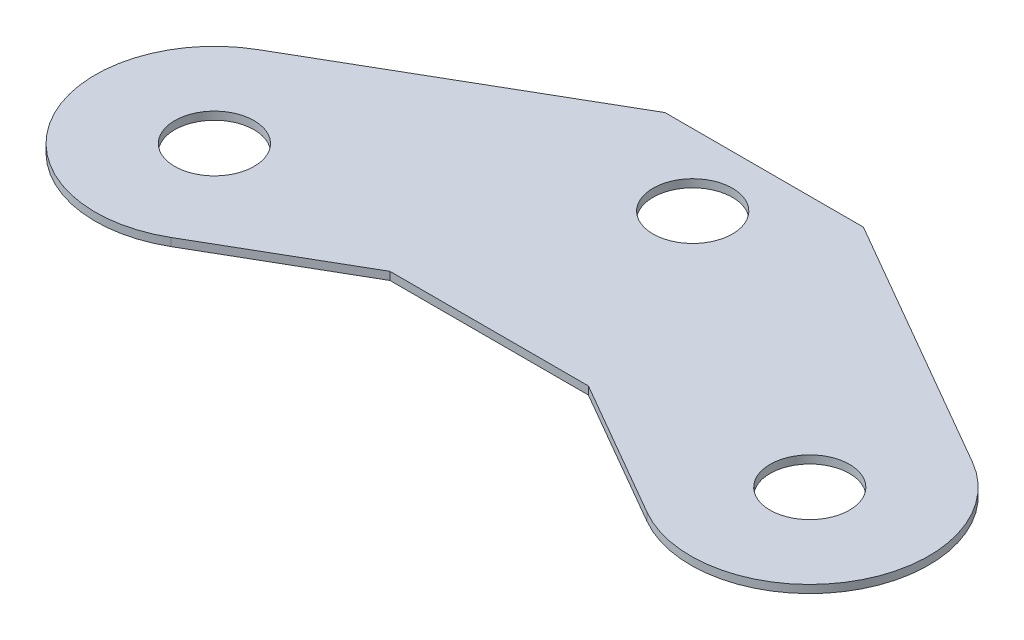
ISO-10303-21;
HEADER;
FILE_DESCRIPTION(('STEP AP214'),'2;1');
FILE_NAME('part.step','',(''),(''),'','','');
FILE_SCHEMA(('AUTOMOTIVE_DESIGN { 1 0 10303 214 1 1 1 1 }'));
ENDSEC;
DATA;
#1=APPLICATION_CONTEXT('core data for automotive mechanical design processes');
#2=APPLICATION_PROTOCOL_DEFINITION('international standard','automotive_design',2000,#1);
#3=PRODUCT_CONTEXT('',#1,'mechanical');
#4=PRODUCT('Part','Part','',(#3));
#5=PRODUCT_RELATED_PRODUCT_CATEGORY('part','',(#4));
#6=PRODUCT_DEFINITION_FORMATION('','',#4);
#7=PRODUCT_DEFINITION_CONTEXT('part definition',#1,'design');
#8=PRODUCT_DEFINITION('design','',#6,#7);
#9=PRODUCT_DEFINITION_SHAPE('','',#8);
#10=(LENGTH_UNIT() NAMED_UNIT(*) SI_UNIT(.MILLI.,.METRE.));
#11=(NAMED_UNIT(*) PLANE_ANGLE_UNIT() SI_UNIT($,.RADIAN.));
#12=(NAMED_UNIT(*) SI_UNIT($,.STERADIAN.) SOLID_ANGLE_UNIT());
#13=UNCERTAINTY_MEASURE_WITH_UNIT(LENGTH_MEASURE(1.E-05),#10,'distance_accuracy_value','');
#14=(GEOMETRIC_REPRESENTATION_CONTEXT(3) GLOBAL_UNCERTAINTY_ASSIGNED_CONTEXT((#13)) GLOBAL_UNIT_ASSIGNED_CONTEXT((#10,
#11,#12)) REPRESENTATION_CONTEXT('',''));
#15=CARTESIAN_POINT('',(0.,0.,0.));
#16=DIRECTION('',(0.,0.,1.));
#17=DIRECTION('',(1.,0.,0.));
#18=AXIS2_PLACEMENT_3D('',#15,#16,#17);
#19=CARTESIAN_POINT('',(-12.5,1.,-34.6410161513776));
#20=DIRECTION('',(0.499999999999998,0.,0.86602540378444));
#21=DIRECTION('',(-0.86602540378444,0.,0.499999999999998));
#22=AXIS2_PLACEMENT_3D('',#19,#20,#21);
#23=PLANE('',#22);
#24=DIRECTION('',(0.,1.,0.));
#25=VECTOR('',#24,1.);
#26=CARTESIAN_POINT('',(-12.5,1.,-34.6410161513776));
#27=LINE('',#26,#25);
#28=CARTESIAN_POINT('',(-12.5,0.,-34.6410161513776));
#29=VERTEX_POINT('',#28);
#30=CARTESIAN_POINT('',(-12.5,1.,-34.6410161513776));
#31=VERTEX_POINT('',#30);
#32=EDGE_CURVE('E11',#29,#31,#27,.T.);
#33=ORIENTED_EDGE('',*,*,#32,.F.);
#34=DIRECTION('',(-0.86602540378444,0.,0.499999999999998));
#35=VECTOR('',#34,1.);
#36=CARTESIAN_POINT('',(-12.5,0.,-34.6410161513776));
#37=LINE('',#36,#35);
#38=CARTESIAN_POINT('',(-45.,0.,-15.8771324027149));
#39=VERTEX_POINT('',#38);
#40=EDGE_CURVE('E106',#29,#39,#37,.T.);
#41=ORIENTED_EDGE('',*,*,#40,.T.);
#42=DIRECTION('',(0.,1.,0.));
#43=VECTOR('',#42,1.);
#44=CARTESIAN_POINT('',(-45.,1.,-15.8771324027149));
#45=LINE('',#44,#43);
#46=CARTESIAN_POINT('',(-45.,1.,-15.8771324027149));
#47=VERTEX_POINT('',#46);
#48=EDGE_CURVE('E47',#39,#47,#45,.T.);
#49=ORIENTED_EDGE('',*,*,#48,.T.);
#50=DIRECTION('',(-0.86602540378444,0.,0.499999999999998));
#51=VECTOR('',#50,1.);
#52=CARTESIAN_POINT('',(-12.5,1.,-34.6410161513776));
#53=LINE('',#52,#51);
#54=EDGE_CURVE('E154',#31,#47,#53,.T.);
#55=ORIENTED_EDGE('',*,*,#54,.F.);
#56=EDGE_LOOP('',(#33,#41,#49,#55));
#57=FACE_BOUND('',#56,.T.);
#58=ADVANCED_FACE('F37',(#57),#23,.F.);
#59=CARTESIAN_POINT('',(-37.5,1.,-2.8867513459483));
#60=DIRECTION('',(0.,-1.,0.));
#61=DIRECTION('',(0.,0.,-1.));
#62=AXIS2_PLACEMENT_3D('',#59,#60,#61);
#63=CYLINDRICAL_SURFACE('',#62,15.);
#64=ORIENTED_EDGE('',*,*,#48,.F.);
#65=CARTESIAN_POINT('',(-37.5,0.,-2.8867513459483));
#66=DIRECTION('',(0.,1.,0.));
#67=DIRECTION('',(0.,0.,1.));
#68=AXIS2_PLACEMENT_3D('',#65,#66,#67);
#69=CIRCLE('',#68,15.);
#70=CARTESIAN_POINT('',(-30.,0.,10.1036297108183));
#71=VERTEX_POINT('',#70);
#72=EDGE_CURVE('E125',#39,#71,#69,.T.);
#73=ORIENTED_EDGE('',*,*,#72,.T.);
#74=DIRECTION('',(0.,1.,0.));
#75=VECTOR('',#74,1.);
#76=CARTESIAN_POINT('',(-30.,1.,10.1036297108183));
#77=LINE('',#76,#75);
#78=CARTESIAN_POINT('',(-30.,1.,10.1036297108183));
#79=VERTEX_POINT('',#78);
#80=EDGE_CURVE('E147',#71,#79,#77,.T.);
#81=ORIENTED_EDGE('',*,*,#80,.T.);
#82=CARTESIAN_POINT('',(-37.5,1.,-2.8867513459483));
#83=DIRECTION('',(0.,1.,0.));
#84=DIRECTION('',(0.,0.,1.));
#85=AXIS2_PLACEMENT_3D('',#82,#83,#84);
#86=CIRCLE('',#85,15.);
#87=EDGE_CURVE('E164',#47,#79,#86,.T.);
#88=ORIENTED_EDGE('',*,*,#87,.F.);
#89=EDGE_LOOP('',(#64,#73,#81,#88));
#90=FACE_BOUND('',#89,.T.);
#91=ADVANCED_FACE('F167',(#90),#63,.T.);
#92=CARTESIAN_POINT('',(-30.,1.,10.1036297108183));
#93=DIRECTION('',(-0.499999999999994,0.,-0.866025403784442));
#94=DIRECTION('',(0.866025403784442,0.,-0.499999999999994));
#95=AXIS2_PLACEMENT_3D('',#92,#93,#94);
#96=PLANE('',#95);
#97=ORIENTED_EDGE('',*,*,#80,.F.);
#98=DIRECTION('',(0.866025403784442,0.,-0.499999999999994));
#99=VECTOR('',#98,1.);
#100=CARTESIAN_POINT('',(-30.,0.,10.1036297108183));
#101=LINE('',#100,#99);
#102=CARTESIAN_POINT('',(-12.5,0.,0.));
#103=VERTEX_POINT('',#102);
#104=EDGE_CURVE('E122',#71,#103,#101,.T.);
#105=ORIENTED_EDGE('',*,*,#104,.T.);
#106=DIRECTION('',(0.,1.,0.));
#107=VECTOR('',#106,1.);
#108=CARTESIAN_POINT('',(-12.5,1.,0.));
#109=LINE('',#108,#107);
#110=CARTESIAN_POINT('',(-12.5,1.,0.));
#111=VERTEX_POINT('',#110);
#112=EDGE_CURVE('E144',#103,#111,#109,.T.);
#113=ORIENTED_EDGE('',*,*,#112,.T.);
#114=DIRECTION('',(0.866025403784442,0.,-0.499999999999994));
#115=VECTOR('',#114,1.);
#116=CARTESIAN_POINT('',(-30.,1.,10.1036297108183));
#117=LINE('',#116,#115);
#118=EDGE_CURVE('E168',#79,#111,#117,.T.);
#119=ORIENTED_EDGE('',*,*,#118,.F.);
#120=EDGE_LOOP('',(#97,#105,#113,#119));
#121=FACE_BOUND('',#120,.T.);
#122=ADVANCED_FACE('F206',(#121),#96,.F.);
#123=CARTESIAN_POINT('',(12.5,1.,0.));
#124=DIRECTION('',(0.,0.,-1.));
#125=DIRECTION('',(1.,0.,0.));
#126=AXIS2_PLACEMENT_3D('',#123,#124,#125);
#127=PLANE('',#126);
#128=ORIENTED_EDGE('',*,*,#112,.F.);
#129=DIRECTION('',(1.,0.,0.));
#130=VECTOR('',#129,1.);
#131=CARTESIAN_POINT('',(37.5,0.,0.));
#132=LINE('',#131,#130);
#133=CARTESIAN_POINT('',(12.5,0.,0.));
#134=VERTEX_POINT('',#133);
#135=EDGE_CURVE('E119',#103,#134,#132,.T.);
#136=ORIENTED_EDGE('',*,*,#135,.T.);
#137=DIRECTION('',(0.,1.,0.));
#138=VECTOR('',#137,1.);
#139=CARTESIAN_POINT('',(12.5,1.,0.));
#140=LINE('',#139,#138);
#141=CARTESIAN_POINT('',(12.5,1.,0.));
#142=VERTEX_POINT('',#141);
#143=EDGE_CURVE('E141',#134,#142,#140,.T.);
#144=ORIENTED_EDGE('',*,*,#143,.T.);
#145=DIRECTION('',(1.,0.,0.));
#146=VECTOR('',#145,1.);
#147=CARTESIAN_POINT('',(12.5,1.,0.));
#148=LINE('',#147,#146);
#149=EDGE_CURVE('E170',#111,#142,#148,.T.);
#150=ORIENTED_EDGE('',*,*,#149,.F.);
#151=EDGE_LOOP('',(#128,#136,#144,#150));
#152=FACE_BOUND('',#151,.T.);
#153=ADVANCED_FACE('F266',(#152),#127,.F.);
#154=CARTESIAN_POINT('',(30.,1.,10.1036297108183));
#155=DIRECTION('',(0.499999999999994,0.,-0.866025403784442));
#156=DIRECTION('',(0.866025403784442,0.,0.499999999999994));
#157=AXIS2_PLACEMENT_3D('',#154,#155,#156);
#158=PLANE('',#157);
#159=ORIENTED_EDGE('',*,*,#143,.F.);
#160=DIRECTION('',(0.866025403784442,0.,0.499999999999994));
#161=VECTOR('',#160,1.);
#162=CARTESIAN_POINT('',(30.,0.,10.1036297108183));
#163=LINE('',#162,#161);
#164=CARTESIAN_POINT('',(30.,0.,10.1036297108183));
#165=VERTEX_POINT('',#164);
#166=EDGE_CURVE('E116',#134,#165,#163,.T.);
#167=ORIENTED_EDGE('',*,*,#166,.T.);
#168=DIRECTION('',(0.,1.,0.));
#169=VECTOR('',#168,1.);
#170=CARTESIAN_POINT('',(30.,1.,10.1036297108183));
#171=LINE('',#170,#169);
#172=CARTESIAN_POINT('',(30.,1.,10.1036297108183));
#173=VERTEX_POINT('',#172);
#174=EDGE_CURVE('E139',#165,#173,#171,.T.);
#175=ORIENTED_EDGE('',*,*,#174,.T.);
#176=DIRECTION('',(0.866025403784442,0.,0.499999999999994));
#177=VECTOR('',#176,1.);
#178=CARTESIAN_POINT('',(30.,1.,10.1036297108183));
#179=LINE('',#178,#177);
#180=EDGE_CURVE('E176',#142,#173,#179,.T.);
#181=ORIENTED_EDGE('',*,*,#180,.F.);
#182=EDGE_LOOP('',(#159,#167,#175,#181));
#183=FACE_BOUND('',#182,.T.);
#184=ADVANCED_FACE('F276',(#183),#158,.F.);
#185=CARTESIAN_POINT('',(37.5,1.,-2.8867513459483));
#186=DIRECTION('',(0.,-1.,0.));
#187=DIRECTION('',(0.,0.,-1.));
#188=AXIS2_PLACEMENT_3D('',#185,#186,#187);
#189=CYLINDRICAL_SURFACE('',#188,15.);
#190=ORIENTED_EDGE('',*,*,#174,.F.);
#191=CARTESIAN_POINT('',(37.5,0.,-2.8867513459483));
#192=DIRECTION('',(0.,1.,0.));
#193=DIRECTION('',(0.,0.,1.));
#194=AXIS2_PLACEMENT_3D('',#191,#192,#193);
#195=CIRCLE('',#194,15.);
#196=CARTESIAN_POINT('',(45.,0.,-15.8771324027149));
#197=VERTEX_POINT('',#196);
#198=EDGE_CURVE('E113',#165,#197,#195,.T.);
#199=ORIENTED_EDGE('',*,*,#198,.T.);
#200=DIRECTION('',(0.,1.,0.));
#201=VECTOR('',#200,1.);
#202=CARTESIAN_POINT('',(45.,1.,-15.8771324027149));
#203=LINE('',#202,#201);
#204=CARTESIAN_POINT('',(45.,1.,-15.8771324027149));
#205=VERTEX_POINT('',#204);
#206=EDGE_CURVE('E55',#197,#205,#203,.T.);
#207=ORIENTED_EDGE('',*,*,#206,.T.);
#208=CARTESIAN_POINT('',(37.5,1.,-2.8867513459483));
#209=DIRECTION('',(0.,1.,0.));
#210=DIRECTION('',(0.,0.,-1.));
#211=AXIS2_PLACEMENT_3D('',#208,#209,#210);
#212=CIRCLE('',#211,15.);
#213=EDGE_CURVE('E179',#173,#205,#212,.T.);
#214=ORIENTED_EDGE('',*,*,#213,.F.);
#215=EDGE_LOOP('',(#190,#199,#207,#214));
#216=FACE_BOUND('',#215,.T.);
#217=ADVANCED_FACE('F287',(#216),#189,.T.);
#218=CARTESIAN_POINT('',(12.5,1.,-34.6410161513776));
#219=DIRECTION('',(-0.499999999999998,0.,0.86602540378444));
#220=DIRECTION('',(-0.86602540378444,0.,-0.499999999999998));
#221=AXIS2_PLACEMENT_3D('',#218,#219,#220);
#222=PLANE('',#221);
#223=ORIENTED_EDGE('',*,*,#206,.F.);
#224=DIRECTION('',(-0.86602540378444,0.,-0.499999999999998));
#225=VECTOR('',#224,1.);
#226=CARTESIAN_POINT('',(12.5,0.,-34.6410161513776));
#227=LINE('',#226,#225);
#228=CARTESIAN_POINT('',(12.5,0.,-34.6410161513776));
#229=VERTEX_POINT('',#228);
#230=EDGE_CURVE('E104',#197,#229,#227,.T.);
#231=ORIENTED_EDGE('',*,*,#230,.T.);
#232=DIRECTION('',(0.,1.,0.));
#233=VECTOR('',#232,1.);
#234=CARTESIAN_POINT('',(12.5,1.,-34.6410161513776));
#235=LINE('',#234,#233);
#236=CARTESIAN_POINT('',(12.5,1.,-34.6410161513776));
#237=VERTEX_POINT('',#236);
#238=EDGE_CURVE('E41',#229,#237,#235,.T.);
#239=ORIENTED_EDGE('',*,*,#238,.T.);
#240=DIRECTION('',(-0.86602540378444,0.,-0.499999999999998));
#241=VECTOR('',#240,1.);
#242=CARTESIAN_POINT('',(12.5,1.,-34.6410161513776));
#243=LINE('',#242,#241);
#244=EDGE_CURVE('E137',#205,#237,#243,.T.);
#245=ORIENTED_EDGE('',*,*,#244,.F.);
#246=EDGE_LOOP('',(#223,#231,#239,#245));
#247=FACE_BOUND('',#246,.T.);
#248=ADVANCED_FACE('F108',(#247),#222,.F.);
#249=CARTESIAN_POINT('',(-12.5,1.,-34.6410161513776));
#250=DIRECTION('',(0.,0.,1.));
#251=DIRECTION('',(-1.,0.,0.));
#252=AXIS2_PLACEMENT_3D('',#249,#250,#251);
#253=PLANE('',#252);
#254=DIRECTION('',(1.,0.,0.));
#255=VECTOR('',#254,1.);
#256=CARTESIAN_POINT('',(37.5,0.,-34.6410161513776));
#257=LINE('',#256,#255);
#258=EDGE_CURVE('E92',#229,#29,#257,.F.);
#259=ORIENTED_EDGE('',*,*,#258,.T.);
#260=ORIENTED_EDGE('',*,*,#32,.T.);
#261=DIRECTION('',(-1.,0.,0.));
#262=VECTOR('',#261,1.);
#263=CARTESIAN_POINT('',(-12.5,1.,-34.6410161513776));
#264=LINE('',#263,#262);
#265=EDGE_CURVE('E94',#237,#31,#264,.T.);
#266=ORIENTED_EDGE('',*,*,#265,.F.);
#267=ORIENTED_EDGE('',*,*,#238,.F.);
#268=EDGE_LOOP('',(#259,#260,#266,#267));
#269=FACE_BOUND('',#268,.T.);
#270=ADVANCED_FACE('F91',(#269),#253,.F.);
#271=CARTESIAN_POINT('',(37.5,1.,-2.8867513459483));
#272=DIRECTION('',(0.,-1.,0.));
#273=DIRECTION('',(0.,0.,-1.));
#274=AXIS2_PLACEMENT_3D('',#271,#272,#273);
#275=CYLINDRICAL_SURFACE('',#274,5.);
#276=CARTESIAN_POINT('',(37.5,1.,-2.8867513459483));
#277=DIRECTION('',(0.,1.,0.));
#278=DIRECTION('',(0.,0.,1.));
#279=AXIS2_PLACEMENT_3D('',#276,#277,#278);
#280=CIRCLE('',#279,5.);
#281=CARTESIAN_POINT('',(37.5,1.,2.1132486540517));
#282=VERTEX_POINT('',#281);
#283=EDGE_CURVE('E182',#282,#282,#280,.T.);
#284=ORIENTED_EDGE('',*,*,#283,.T.);
#285=EDGE_LOOP('',(#284));
#286=FACE_BOUND('',#285,.T.);
#287=CARTESIAN_POINT('',(37.5,0.,-2.8867513459483));
#288=DIRECTION('',(0.,1.,0.));
#289=DIRECTION('',(0.,0.,1.));
#290=AXIS2_PLACEMENT_3D('',#287,#288,#289);
#291=CIRCLE('',#290,5.);
#292=CARTESIAN_POINT('',(37.5,0.,2.1132486540517));
#293=VERTEX_POINT('',#292);
#294=EDGE_CURVE('E115',#293,#293,#291,.T.);
#295=ORIENTED_EDGE('',*,*,#294,.F.);
#296=EDGE_LOOP('',(#295));
#297=FACE_BOUND('',#296,.T.);
#298=ADVANCED_FACE('F212',(#286,#297),#275,.F.);
#299=CARTESIAN_POINT('',(-37.5,1.,-2.8867513459483));
#300=DIRECTION('',(0.,-1.,0.));
#301=DIRECTION('',(0.,0.,-1.));
#302=AXIS2_PLACEMENT_3D('',#299,#300,#301);
#303=CYLINDRICAL_SURFACE('',#302,5.);
#304=CARTESIAN_POINT('',(-37.5,1.,-2.8867513459483));
#305=DIRECTION('',(0.,1.,0.));
#306=DIRECTION('',(0.,0.,-1.));
#307=AXIS2_PLACEMENT_3D('',#304,#305,#306);
#308=CIRCLE('',#307,5.);
#309=CARTESIAN_POINT('',(-37.5,1.,-7.8867513459483));
#310=VERTEX_POINT('',#309);
#311=EDGE_CURVE('E184',#310,#310,#308,.T.);
#312=ORIENTED_EDGE('',*,*,#311,.T.);
#313=EDGE_LOOP('',(#312));
#314=FACE_BOUND('',#313,.T.);
#315=CARTESIAN_POINT('',(-37.5,0.,-2.8867513459483));
#316=DIRECTION('',(0.,1.,0.));
#317=DIRECTION('',(0.,0.,1.));
#318=AXIS2_PLACEMENT_3D('',#315,#316,#317);
#319=CIRCLE('',#318,5.);
#320=CARTESIAN_POINT('',(-37.5,0.,2.11324865405169));
#321=VERTEX_POINT('',#320);
#322=EDGE_CURVE('E131',#321,#321,#319,.T.);
#323=ORIENTED_EDGE('',*,*,#322,.F.);
#324=EDGE_LOOP('',(#323));
#325=FACE_BOUND('',#324,.T.);
#326=ADVANCED_FACE('F200',(#314,#325),#303,.F.);
#327=CARTESIAN_POINT('',(0.,1.,-25.6410161513776));
#328=DIRECTION('',(0.,-1.,0.));
#329=DIRECTION('',(0.,0.,-1.));
#330=AXIS2_PLACEMENT_3D('',#327,#328,#329);
#331=CYLINDRICAL_SURFACE('',#330,5.);
#332=CARTESIAN_POINT('',(0.,1.,-25.6410161513776));
#333=DIRECTION('',(0.,1.,0.));
#334=DIRECTION('',(0.,0.,1.));
#335=AXIS2_PLACEMENT_3D('',#332,#333,#334);
#336=CIRCLE('',#335,5.);
#337=CARTESIAN_POINT('',(0.,1.,-20.6410161513776));
#338=VERTEX_POINT('',#337);
#339=EDGE_CURVE('E98',#338,#338,#336,.T.);
#340=ORIENTED_EDGE('',*,*,#339,.T.);
#341=EDGE_LOOP('',(#340));
#342=FACE_BOUND('',#341,.T.);
#343=CARTESIAN_POINT('',(0.,0.,-25.6410161513776));
#344=DIRECTION('',(0.,1.,0.));
#345=DIRECTION('',(0.,0.,1.));
#346=AXIS2_PLACEMENT_3D('',#343,#344,#345);
#347=CIRCLE('',#346,5.);
#348=CARTESIAN_POINT('',(0.,0.,-20.6410161513776));
#349=VERTEX_POINT('',#348);
#350=EDGE_CURVE('E134',#349,#349,#347,.T.);
#351=ORIENTED_EDGE('',*,*,#350,.F.);
#352=EDGE_LOOP('',(#351));
#353=FACE_BOUND('',#352,.T.);
#354=ADVANCED_FACE('F39',(#342,#353),#331,.F.);
#355=CARTESIAN_POINT('',(37.5,1.,-2.8867513459483));
#356=DIRECTION('',(0.,-1.,0.));
#357=DIRECTION('',(0.,0.,-1.));
#358=AXIS2_PLACEMENT_3D('',#355,#356,#357);
#359=PLANE('',#358);
#360=ORIENTED_EDGE('',*,*,#244,.T.);
#361=ORIENTED_EDGE('',*,*,#265,.T.);
#362=ORIENTED_EDGE('',*,*,#54,.T.);
#363=ORIENTED_EDGE('',*,*,#87,.T.);
#364=ORIENTED_EDGE('',*,*,#118,.T.);
#365=ORIENTED_EDGE('',*,*,#149,.T.);
#366=ORIENTED_EDGE('',*,*,#180,.T.);
#367=ORIENTED_EDGE('',*,*,#213,.T.);
#368=EDGE_LOOP('',(#360,#361,#362,#363,#364,#365,#366,#367));
#369=FACE_BOUND('',#368,.T.);
#370=ORIENTED_EDGE('',*,*,#283,.F.);
#371=EDGE_LOOP('',(#370));
#372=FACE_BOUND('',#371,.T.);
#373=ORIENTED_EDGE('',*,*,#311,.F.);
#374=EDGE_LOOP('',(#373));
#375=FACE_BOUND('',#374,.T.);
#376=ORIENTED_EDGE('',*,*,#339,.F.);
#377=EDGE_LOOP('',(#376));
#378=FACE_BOUND('',#377,.T.);
#379=ADVANCED_FACE('F161',(#369,#372,#375,#378),#359,.F.);
#380=CARTESIAN_POINT('',(37.5,0.,-2.8867513459483));
#381=DIRECTION('',(0.,-1.,0.));
#382=DIRECTION('',(0.,0.,-1.));
#383=AXIS2_PLACEMENT_3D('',#380,#381,#382);
#384=PLANE('',#383);
#385=ORIENTED_EDGE('',*,*,#230,.F.);
#386=ORIENTED_EDGE('',*,*,#198,.F.);
#387=ORIENTED_EDGE('',*,*,#166,.F.);
#388=ORIENTED_EDGE('',*,*,#135,.F.);
#389=ORIENTED_EDGE('',*,*,#104,.F.);
#390=ORIENTED_EDGE('',*,*,#72,.F.);
#391=ORIENTED_EDGE('',*,*,#40,.F.);
#392=ORIENTED_EDGE('',*,*,#258,.F.);
#393=EDGE_LOOP('',(#385,#386,#387,#388,#389,#390,#391,#392));
#394=FACE_BOUND('',#393,.T.);
#395=ORIENTED_EDGE('',*,*,#294,.T.);
#396=EDGE_LOOP('',(#395));
#397=FACE_BOUND('',#396,.T.);
#398=ORIENTED_EDGE('',*,*,#322,.T.);
#399=EDGE_LOOP('',(#398));
#400=FACE_BOUND('',#399,.T.);
#401=ORIENTED_EDGE('',*,*,#350,.T.);
#402=EDGE_LOOP('',(#401));
#403=FACE_BOUND('',#402,.T.);
#404=ADVANCED_FACE('F101',(#394,#397,#400,#403),#384,.T.);
#405=CLOSED_SHELL('',(#58,#91,#122,#153,#184,#217,#248,#270,#298,#326,#354,#379,#404));
#406=MANIFOLD_SOLID_BREP('B2',#405);
#407=ADVANCED_BREP_SHAPE_REPRESENTATION('',(#18,#406),#14);
#408=SHAPE_DEFINITION_REPRESENTATION(#9,#407);
ENDSEC;
END-ISO-10303-21;
